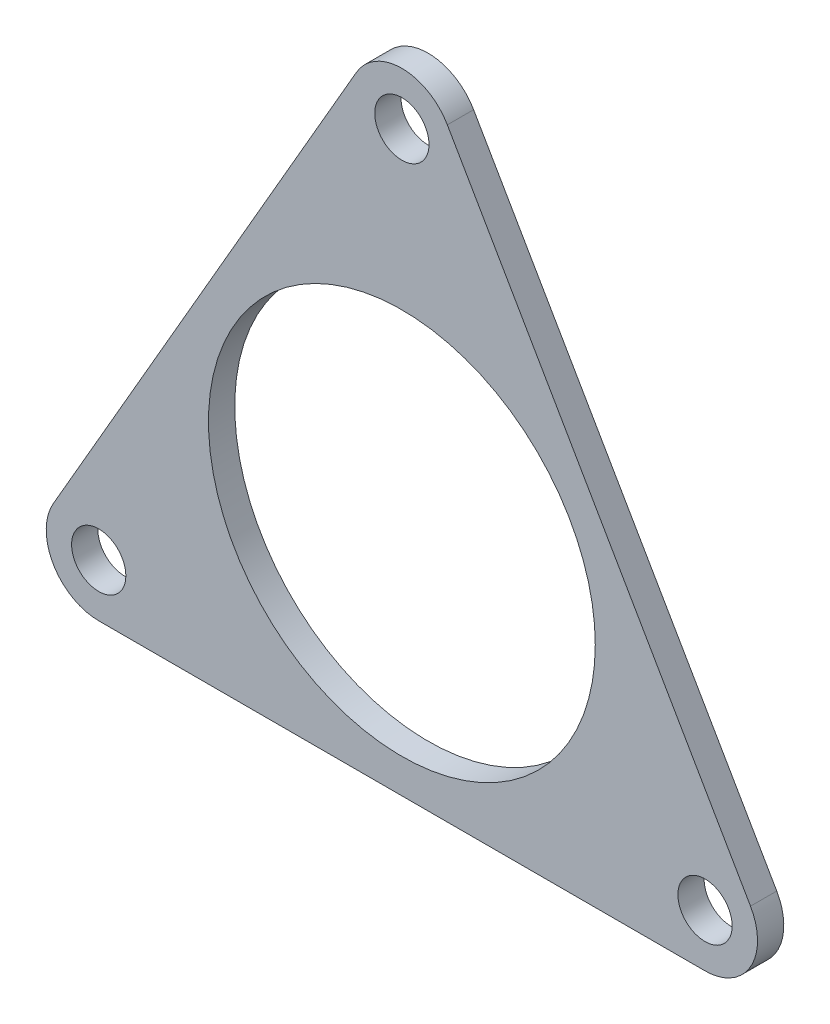
ISO-10303-21;
HEADER;
FILE_DESCRIPTION(('STEP AP214'),'2;1');
FILE_NAME('part.step','',(''),(''),'','','');
FILE_SCHEMA(('AUTOMOTIVE_DESIGN { 1 0 10303 214 1 1 1 1 }'));
ENDSEC;
DATA;
#1=APPLICATION_CONTEXT('core data for automotive mechanical design processes');
#2=APPLICATION_PROTOCOL_DEFINITION('international standard','automotive_design',2000,#1);
#3=PRODUCT_CONTEXT('',#1,'mechanical');
#4=PRODUCT('Part','Part','',(#3));
#5=PRODUCT_RELATED_PRODUCT_CATEGORY('part','',(#4));
#6=PRODUCT_DEFINITION_FORMATION('','',#4);
#7=PRODUCT_DEFINITION_CONTEXT('part definition',#1,'design');
#8=PRODUCT_DEFINITION('design','',#6,#7);
#9=PRODUCT_DEFINITION_SHAPE('','',#8);
#10=(LENGTH_UNIT() NAMED_UNIT(*) SI_UNIT(.MILLI.,.METRE.));
#11=(NAMED_UNIT(*) PLANE_ANGLE_UNIT() SI_UNIT($,.RADIAN.));
#12=(NAMED_UNIT(*) SI_UNIT($,.STERADIAN.) SOLID_ANGLE_UNIT());
#13=UNCERTAINTY_MEASURE_WITH_UNIT(LENGTH_MEASURE(1.E-05),#10,'distance_accuracy_value','');
#14=(GEOMETRIC_REPRESENTATION_CONTEXT(3) GLOBAL_UNCERTAINTY_ASSIGNED_CONTEXT((#13)) GLOBAL_UNIT_ASSIGNED_CONTEXT((#10,
#11,#12)) REPRESENTATION_CONTEXT('',''));
#15=CARTESIAN_POINT('',(0.,0.,0.));
#16=DIRECTION('',(0.,0.,1.));
#17=DIRECTION('',(1.,0.,0.));
#18=AXIS2_PLACEMENT_3D('',#15,#16,#17);
#19=CARTESIAN_POINT('',(0.,20.,1.5));
#20=DIRECTION('',(0.,0.,1.));
#21=DIRECTION('',(1.,0.,0.));
#22=AXIS2_PLACEMENT_3D('',#19,#20,#21);
#23=PLANE('',#22);
#24=CARTESIAN_POINT('',(0.,0.,1.5));
#25=DIRECTION('',(0.,0.,1.));
#26=DIRECTION('',(1.,0.,0.));
#27=AXIS2_PLACEMENT_3D('',#24,#25,#26);
#28=CIRCLE('',#27,11.05);
#29=CARTESIAN_POINT('',(11.05,0.,1.5));
#30=VERTEX_POINT('',#29);
#31=EDGE_CURVE('E186',#30,#30,#28,.T.);
#32=ORIENTED_EDGE('',*,*,#31,.F.);
#33=EDGE_LOOP('',(#32));
#34=FACE_BOUND('',#33,.T.);
#35=CARTESIAN_POINT('',(-17.3205080756888,-9.99999999999997,1.5));
#36=DIRECTION('',(0.,0.,1.));
#37=DIRECTION('',(1.,0.,0.));
#38=AXIS2_PLACEMENT_3D('',#35,#36,#37);
#39=CIRCLE('',#38,1.55);
#40=CARTESIAN_POINT('',(-15.7705080756888,-9.99999999999997,1.5));
#41=VERTEX_POINT('',#40);
#42=EDGE_CURVE('E197',#41,#41,#39,.T.);
#43=ORIENTED_EDGE('',*,*,#42,.F.);
#44=EDGE_LOOP('',(#43));
#45=FACE_BOUND('',#44,.T.);
#46=CARTESIAN_POINT('',(0.,20.,1.5));
#47=DIRECTION('',(0.,0.,1.));
#48=DIRECTION('',(1.,0.,0.));
#49=AXIS2_PLACEMENT_3D('',#46,#47,#48);
#50=CIRCLE('',#49,3.);
#51=CARTESIAN_POINT('',(2.59807621135332,21.5,1.5));
#52=VERTEX_POINT('',#51);
#53=CARTESIAN_POINT('',(-2.59807621135331,21.5,1.5));
#54=VERTEX_POINT('',#53);
#55=EDGE_CURVE('E132',#52,#54,#50,.T.);
#56=ORIENTED_EDGE('',*,*,#55,.T.);
#57=DIRECTION('',(-0.500000000000001,-0.866025403784438,0.));
#58=VECTOR('',#57,1.);
#59=CARTESIAN_POINT('',(-2.59807621135331,21.5,1.5));
#60=LINE('',#59,#58);
#61=CARTESIAN_POINT('',(-19.9185842870421,-8.49999999999997,1.5));
#62=VERTEX_POINT('',#61);
#63=EDGE_CURVE('E90',#54,#62,#60,.T.);
#64=ORIENTED_EDGE('',*,*,#63,.T.);
#65=CARTESIAN_POINT('',(-17.3205080756888,-9.99999999999997,1.5));
#66=DIRECTION('',(0.,0.,1.));
#67=DIRECTION('',(1.,0.,0.));
#68=AXIS2_PLACEMENT_3D('',#65,#66,#67);
#69=CIRCLE('',#68,3.);
#70=CARTESIAN_POINT('',(-17.3205080756888,-13.,1.5));
#71=VERTEX_POINT('',#70);
#72=EDGE_CURVE('E103',#62,#71,#69,.T.);
#73=ORIENTED_EDGE('',*,*,#72,.T.);
#74=DIRECTION('',(1.,0.,0.));
#75=VECTOR('',#74,1.);
#76=CARTESIAN_POINT('',(-17.3205080756888,-13.,1.5));
#77=LINE('',#76,#75);
#78=CARTESIAN_POINT('',(17.3205080756888,-13.,1.5));
#79=VERTEX_POINT('',#78);
#80=EDGE_CURVE('E97',#71,#79,#77,.T.);
#81=ORIENTED_EDGE('',*,*,#80,.T.);
#82=CARTESIAN_POINT('',(17.3205080756888,-9.99999999999995,1.5));
#83=DIRECTION('',(0.,0.,1.));
#84=DIRECTION('',(1.,0.,0.));
#85=AXIS2_PLACEMENT_3D('',#82,#83,#84);
#86=CIRCLE('',#85,3.);
#87=CARTESIAN_POINT('',(19.9185842870421,-8.49999999999995,1.5));
#88=VERTEX_POINT('',#87);
#89=EDGE_CURVE('E101',#79,#88,#86,.T.);
#90=ORIENTED_EDGE('',*,*,#89,.T.);
#91=DIRECTION('',(-0.500000000000001,0.866025403784438,0.));
#92=VECTOR('',#91,1.);
#93=CARTESIAN_POINT('',(2.59807621135332,21.5,1.5));
#94=LINE('',#93,#92);
#95=EDGE_CURVE('E53',#88,#52,#94,.T.);
#96=ORIENTED_EDGE('',*,*,#95,.T.);
#97=EDGE_LOOP('',(#56,#64,#73,#81,#90,#96));
#98=FACE_BOUND('',#97,.T.);
#99=CARTESIAN_POINT('',(0.,20.,1.5));
#100=DIRECTION('',(0.,0.,1.));
#101=DIRECTION('',(1.,0.,0.));
#102=AXIS2_PLACEMENT_3D('',#99,#100,#101);
#103=CIRCLE('',#102,1.55);
#104=CARTESIAN_POINT('',(1.55,20.,1.5));
#105=VERTEX_POINT('',#104);
#106=EDGE_CURVE('E125',#105,#105,#103,.T.);
#107=ORIENTED_EDGE('',*,*,#106,.F.);
#108=EDGE_LOOP('',(#107));
#109=FACE_BOUND('',#108,.T.);
#110=CARTESIAN_POINT('',(17.3205080756888,-9.99999999999995,1.5));
#111=DIRECTION('',(0.,0.,1.));
#112=DIRECTION('',(1.,0.,0.));
#113=AXIS2_PLACEMENT_3D('',#110,#111,#112);
#114=CIRCLE('',#113,1.55);
#115=CARTESIAN_POINT('',(18.8705080756888,-9.99999999999995,1.5));
#116=VERTEX_POINT('',#115);
#117=EDGE_CURVE('E191',#116,#116,#114,.T.);
#118=ORIENTED_EDGE('',*,*,#117,.F.);
#119=EDGE_LOOP('',(#118));
#120=FACE_BOUND('',#119,.T.);
#121=ADVANCED_FACE('F36',(#34,#45,#98,#109,#120),#23,.T.);
#122=CARTESIAN_POINT('',(0.,20.,0.));
#123=DIRECTION('',(0.,0.,1.));
#124=DIRECTION('',(1.,0.,0.));
#125=AXIS2_PLACEMENT_3D('',#122,#123,#124);
#126=PLANE('',#125);
#127=CARTESIAN_POINT('',(0.,0.,0.));
#128=DIRECTION('',(0.,0.,1.));
#129=DIRECTION('',(1.,0.,0.));
#130=AXIS2_PLACEMENT_3D('',#127,#128,#129);
#131=CIRCLE('',#130,11.05);
#132=CARTESIAN_POINT('',(11.05,0.,0.));
#133=VERTEX_POINT('',#132);
#134=EDGE_CURVE('E184',#133,#133,#131,.T.);
#135=ORIENTED_EDGE('',*,*,#134,.T.);
#136=EDGE_LOOP('',(#135));
#137=FACE_BOUND('',#136,.T.);
#138=CARTESIAN_POINT('',(0.,20.,0.));
#139=DIRECTION('',(0.,0.,1.));
#140=DIRECTION('',(1.,0.,0.));
#141=AXIS2_PLACEMENT_3D('',#138,#139,#140);
#142=CIRCLE('',#141,3.);
#143=CARTESIAN_POINT('',(2.59807621135332,21.5,0.));
#144=VERTEX_POINT('',#143);
#145=CARTESIAN_POINT('',(-2.59807621135331,21.5,0.));
#146=VERTEX_POINT('',#145);
#147=EDGE_CURVE('E121',#144,#146,#142,.T.);
#148=ORIENTED_EDGE('',*,*,#147,.F.);
#149=DIRECTION('',(-0.500000000000001,0.866025403784438,0.));
#150=VECTOR('',#149,1.);
#151=CARTESIAN_POINT('',(2.59807621135332,21.5,0.));
#152=LINE('',#151,#150);
#153=CARTESIAN_POINT('',(19.9185842870421,-8.49999999999995,0.));
#154=VERTEX_POINT('',#153);
#155=EDGE_CURVE('E82',#154,#144,#152,.T.);
#156=ORIENTED_EDGE('',*,*,#155,.F.);
#157=CARTESIAN_POINT('',(17.3205080756888,-9.99999999999995,0.));
#158=DIRECTION('',(0.,0.,1.));
#159=DIRECTION('',(1.,0.,0.));
#160=AXIS2_PLACEMENT_3D('',#157,#158,#159);
#161=CIRCLE('',#160,3.);
#162=CARTESIAN_POINT('',(17.3205080756888,-13.,0.));
#163=VERTEX_POINT('',#162);
#164=EDGE_CURVE('E76',#163,#154,#161,.T.);
#165=ORIENTED_EDGE('',*,*,#164,.F.);
#166=DIRECTION('',(1.,0.,0.));
#167=VECTOR('',#166,1.);
#168=CARTESIAN_POINT('',(-17.3205080756888,-13.,0.));
#169=LINE('',#168,#167);
#170=CARTESIAN_POINT('',(-17.3205080756888,-13.,0.));
#171=VERTEX_POINT('',#170);
#172=EDGE_CURVE('E111',#171,#163,#169,.T.);
#173=ORIENTED_EDGE('',*,*,#172,.F.);
#174=CARTESIAN_POINT('',(-17.3205080756888,-9.99999999999997,0.));
#175=DIRECTION('',(0.,0.,1.));
#176=DIRECTION('',(1.,0.,0.));
#177=AXIS2_PLACEMENT_3D('',#174,#175,#176);
#178=CIRCLE('',#177,3.);
#179=CARTESIAN_POINT('',(-19.9185842870421,-8.49999999999997,0.));
#180=VERTEX_POINT('',#179);
#181=EDGE_CURVE('E127',#180,#171,#178,.T.);
#182=ORIENTED_EDGE('',*,*,#181,.F.);
#183=DIRECTION('',(-0.500000000000001,-0.866025403784438,0.));
#184=VECTOR('',#183,1.);
#185=CARTESIAN_POINT('',(-2.59807621135331,21.5,0.));
#186=LINE('',#185,#184);
#187=EDGE_CURVE('E124',#146,#180,#186,.T.);
#188=ORIENTED_EDGE('',*,*,#187,.F.);
#189=EDGE_LOOP('',(#148,#156,#165,#173,#182,#188));
#190=FACE_BOUND('',#189,.T.);
#191=CARTESIAN_POINT('',(0.,20.,0.));
#192=DIRECTION('',(0.,0.,1.));
#193=DIRECTION('',(1.,0.,0.));
#194=AXIS2_PLACEMENT_3D('',#191,#192,#193);
#195=CIRCLE('',#194,1.55);
#196=CARTESIAN_POINT('',(1.55,20.,0.));
#197=VERTEX_POINT('',#196);
#198=EDGE_CURVE('E200',#197,#197,#195,.T.);
#199=ORIENTED_EDGE('',*,*,#198,.T.);
#200=EDGE_LOOP('',(#199));
#201=FACE_BOUND('',#200,.T.);
#202=CARTESIAN_POINT('',(-17.3205080756888,-9.99999999999997,0.));
#203=DIRECTION('',(0.,0.,1.));
#204=DIRECTION('',(1.,0.,0.));
#205=AXIS2_PLACEMENT_3D('',#202,#203,#204);
#206=CIRCLE('',#205,1.55);
#207=CARTESIAN_POINT('',(-15.7705080756888,-9.99999999999997,0.));
#208=VERTEX_POINT('',#207);
#209=EDGE_CURVE('E194',#208,#208,#206,.T.);
#210=ORIENTED_EDGE('',*,*,#209,.T.);
#211=EDGE_LOOP('',(#210));
#212=FACE_BOUND('',#211,.T.);
#213=CARTESIAN_POINT('',(17.3205080756888,-9.99999999999995,0.));
#214=DIRECTION('',(0.,0.,1.));
#215=DIRECTION('',(1.,0.,0.));
#216=AXIS2_PLACEMENT_3D('',#213,#214,#215);
#217=CIRCLE('',#216,1.55);
#218=CARTESIAN_POINT('',(18.8705080756888,-9.99999999999995,0.));
#219=VERTEX_POINT('',#218);
#220=EDGE_CURVE('E188',#219,#219,#217,.T.);
#221=ORIENTED_EDGE('',*,*,#220,.T.);
#222=EDGE_LOOP('',(#221));
#223=FACE_BOUND('',#222,.T.);
#224=ADVANCED_FACE('F141',(#137,#190,#201,#212,#223),#126,.F.);
#225=CARTESIAN_POINT('',(0.,20.,1.5));
#226=DIRECTION('',(0.,0.,-1.));
#227=DIRECTION('',(-1.,0.,0.));
#228=AXIS2_PLACEMENT_3D('',#225,#226,#227);
#229=CYLINDRICAL_SURFACE('',#228,3.);
#230=ORIENTED_EDGE('',*,*,#147,.T.);
#231=DIRECTION('',(0.,0.,-1.));
#232=VECTOR('',#231,1.);
#233=CARTESIAN_POINT('',(-2.59807621135331,21.5,1.5));
#234=LINE('',#233,#232);
#235=EDGE_CURVE('E11',#54,#146,#234,.T.);
#236=ORIENTED_EDGE('',*,*,#235,.F.);
#237=ORIENTED_EDGE('',*,*,#55,.F.);
#238=DIRECTION('',(0.,0.,-1.));
#239=VECTOR('',#238,1.);
#240=CARTESIAN_POINT('',(2.59807621135332,21.5,1.5));
#241=LINE('',#240,#239);
#242=EDGE_CURVE('E117',#52,#144,#241,.T.);
#243=ORIENTED_EDGE('',*,*,#242,.T.);
#244=EDGE_LOOP('',(#230,#236,#237,#243));
#245=FACE_BOUND('',#244,.T.);
#246=ADVANCED_FACE('F38',(#245),#229,.T.);
#247=CARTESIAN_POINT('',(-2.59807621135331,21.5,1.5));
#248=DIRECTION('',(0.866025403784438,-0.500000000000001,0.));
#249=DIRECTION('',(0.500000000000001,0.866025403784438,0.));
#250=AXIS2_PLACEMENT_3D('',#247,#248,#249);
#251=PLANE('',#250);
#252=ORIENTED_EDGE('',*,*,#187,.T.);
#253=DIRECTION('',(0.,0.,-1.));
#254=VECTOR('',#253,1.);
#255=CARTESIAN_POINT('',(-19.9185842870421,-8.49999999999997,1.5));
#256=LINE('',#255,#254);
#257=EDGE_CURVE('E45',#62,#180,#256,.T.);
#258=ORIENTED_EDGE('',*,*,#257,.F.);
#259=ORIENTED_EDGE('',*,*,#63,.F.);
#260=ORIENTED_EDGE('',*,*,#235,.T.);
#261=EDGE_LOOP('',(#252,#258,#259,#260));
#262=FACE_BOUND('',#261,.T.);
#263=ADVANCED_FACE('F260',(#262),#251,.F.);
#264=CARTESIAN_POINT('',(-17.3205080756888,-9.99999999999997,1.5));
#265=DIRECTION('',(0.,0.,-1.));
#266=DIRECTION('',(-1.,0.,0.));
#267=AXIS2_PLACEMENT_3D('',#264,#265,#266);
#268=CYLINDRICAL_SURFACE('',#267,3.);
#269=ORIENTED_EDGE('',*,*,#181,.T.);
#270=DIRECTION('',(0.,0.,-1.));
#271=VECTOR('',#270,1.);
#272=CARTESIAN_POINT('',(-17.3205080756888,-13.,1.5));
#273=LINE('',#272,#271);
#274=EDGE_CURVE('E112',#71,#171,#273,.T.);
#275=ORIENTED_EDGE('',*,*,#274,.F.);
#276=ORIENTED_EDGE('',*,*,#72,.F.);
#277=ORIENTED_EDGE('',*,*,#257,.T.);
#278=EDGE_LOOP('',(#269,#275,#276,#277));
#279=FACE_BOUND('',#278,.T.);
#280=ADVANCED_FACE('F138',(#279),#268,.T.);
#281=CARTESIAN_POINT('',(-17.3205080756888,-13.,1.5));
#282=DIRECTION('',(0.,1.,0.));
#283=DIRECTION('',(-1.,0.,0.));
#284=AXIS2_PLACEMENT_3D('',#281,#282,#283);
#285=PLANE('',#284);
#286=ORIENTED_EDGE('',*,*,#172,.T.);
#287=DIRECTION('',(0.,0.,-1.));
#288=VECTOR('',#287,1.);
#289=CARTESIAN_POINT('',(17.3205080756888,-13.,1.5));
#290=LINE('',#289,#288);
#291=EDGE_CURVE('E108',#79,#163,#290,.T.);
#292=ORIENTED_EDGE('',*,*,#291,.F.);
#293=ORIENTED_EDGE('',*,*,#80,.F.);
#294=ORIENTED_EDGE('',*,*,#274,.T.);
#295=EDGE_LOOP('',(#286,#292,#293,#294));
#296=FACE_BOUND('',#295,.T.);
#297=ADVANCED_FACE('F109',(#296),#285,.F.);
#298=CARTESIAN_POINT('',(17.3205080756888,-9.99999999999995,1.5));
#299=DIRECTION('',(0.,0.,-1.));
#300=DIRECTION('',(-1.,0.,0.));
#301=AXIS2_PLACEMENT_3D('',#298,#299,#300);
#302=CYLINDRICAL_SURFACE('',#301,3.);
#303=ORIENTED_EDGE('',*,*,#164,.T.);
#304=DIRECTION('',(0.,0.,-1.));
#305=VECTOR('',#304,1.);
#306=CARTESIAN_POINT('',(19.9185842870421,-8.49999999999995,1.5));
#307=LINE('',#306,#305);
#308=EDGE_CURVE('E113',#88,#154,#307,.T.);
#309=ORIENTED_EDGE('',*,*,#308,.F.);
#310=ORIENTED_EDGE('',*,*,#89,.F.);
#311=ORIENTED_EDGE('',*,*,#291,.T.);
#312=EDGE_LOOP('',(#303,#309,#310,#311));
#313=FACE_BOUND('',#312,.T.);
#314=ADVANCED_FACE('F115',(#313),#302,.T.);
#315=CARTESIAN_POINT('',(2.59807621135332,21.5,1.5));
#316=DIRECTION('',(-0.866025403784438,-0.500000000000001,0.));
#317=DIRECTION('',(0.500000000000001,-0.866025403784438,0.));
#318=AXIS2_PLACEMENT_3D('',#315,#316,#317);
#319=PLANE('',#318);
#320=ORIENTED_EDGE('',*,*,#155,.T.);
#321=ORIENTED_EDGE('',*,*,#242,.F.);
#322=ORIENTED_EDGE('',*,*,#95,.F.);
#323=ORIENTED_EDGE('',*,*,#308,.T.);
#324=EDGE_LOOP('',(#320,#321,#322,#323));
#325=FACE_BOUND('',#324,.T.);
#326=ADVANCED_FACE('F146',(#325),#319,.F.);
#327=CARTESIAN_POINT('',(0.,20.,1.5));
#328=DIRECTION('',(0.,0.,-1.));
#329=DIRECTION('',(-1.,0.,0.));
#330=AXIS2_PLACEMENT_3D('',#327,#328,#329);
#331=CYLINDRICAL_SURFACE('',#330,1.55);
#332=ORIENTED_EDGE('',*,*,#106,.T.);
#333=EDGE_LOOP('',(#332));
#334=FACE_BOUND('',#333,.T.);
#335=ORIENTED_EDGE('',*,*,#198,.F.);
#336=EDGE_LOOP('',(#335));
#337=FACE_BOUND('',#336,.T.);
#338=ADVANCED_FACE('F148',(#334,#337),#331,.F.);
#339=CARTESIAN_POINT('',(-17.3205080756888,-9.99999999999997,1.5));
#340=DIRECTION('',(0.,0.,-1.));
#341=DIRECTION('',(-1.,0.,0.));
#342=AXIS2_PLACEMENT_3D('',#339,#340,#341);
#343=CYLINDRICAL_SURFACE('',#342,1.55);
#344=ORIENTED_EDGE('',*,*,#42,.T.);
#345=EDGE_LOOP('',(#344));
#346=FACE_BOUND('',#345,.T.);
#347=ORIENTED_EDGE('',*,*,#209,.F.);
#348=EDGE_LOOP('',(#347));
#349=FACE_BOUND('',#348,.T.);
#350=ADVANCED_FACE('F154',(#346,#349),#343,.F.);
#351=CARTESIAN_POINT('',(17.3205080756888,-9.99999999999995,1.5));
#352=DIRECTION('',(0.,0.,-1.));
#353=DIRECTION('',(-1.,0.,0.));
#354=AXIS2_PLACEMENT_3D('',#351,#352,#353);
#355=CYLINDRICAL_SURFACE('',#354,1.55);
#356=ORIENTED_EDGE('',*,*,#117,.T.);
#357=EDGE_LOOP('',(#356));
#358=FACE_BOUND('',#357,.T.);
#359=ORIENTED_EDGE('',*,*,#220,.F.);
#360=EDGE_LOOP('',(#359));
#361=FACE_BOUND('',#360,.T.);
#362=ADVANCED_FACE('F171',(#358,#361),#355,.F.);
#363=CARTESIAN_POINT('',(0.,0.,0.));
#364=DIRECTION('',(0.,0.,1.));
#365=DIRECTION('',(1.,0.,0.));
#366=AXIS2_PLACEMENT_3D('',#363,#364,#365);
#367=CYLINDRICAL_SURFACE('',#366,11.05);
#368=ORIENTED_EDGE('',*,*,#134,.F.);
#369=EDGE_LOOP('',(#368));
#370=FACE_BOUND('',#369,.T.);
#371=ORIENTED_EDGE('',*,*,#31,.T.);
#372=EDGE_LOOP('',(#371));
#373=FACE_BOUND('',#372,.T.);
#374=ADVANCED_FACE('F175',(#370,#373),#367,.F.);
#375=CLOSED_SHELL('',(#121,#224,#246,#263,#280,#297,#314,#326,#338,#350,#362,#374));
#376=MANIFOLD_SOLID_BREP('B2',#375);
#377=ADVANCED_BREP_SHAPE_REPRESENTATION('',(#18,#376),#14);
#378=SHAPE_DEFINITION_REPRESENTATION(#9,#377);
ENDSEC;
END-ISO-10303-21;
